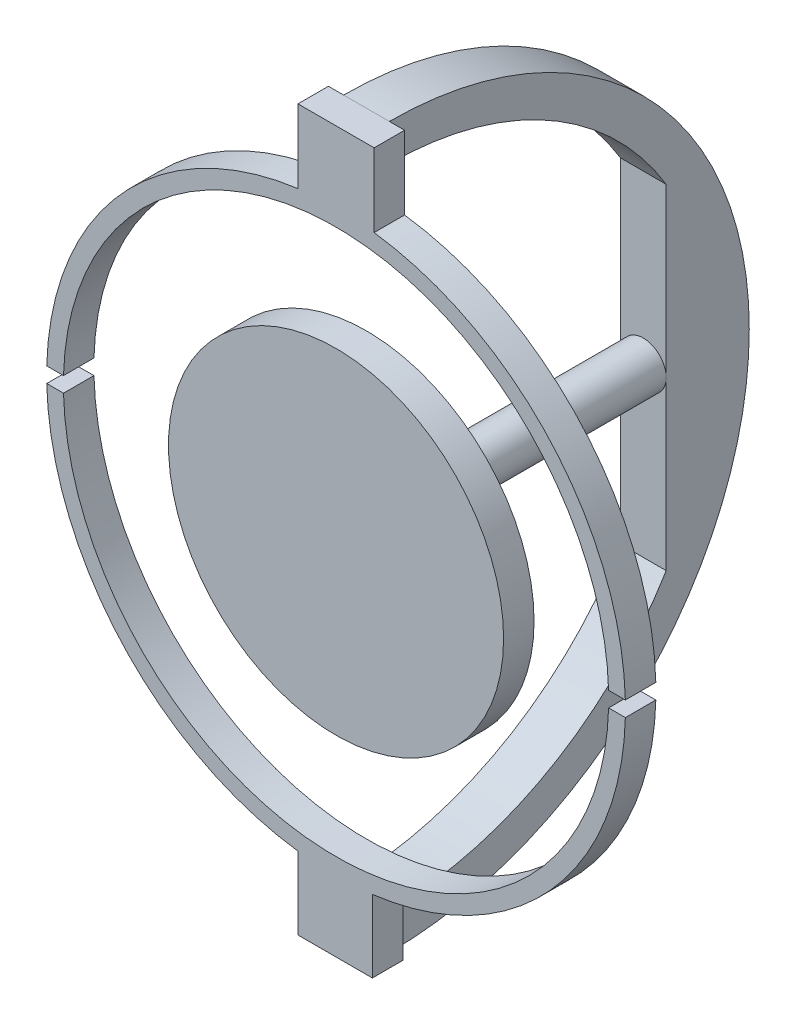
ISO-10303-21;
HEADER;
FILE_DESCRIPTION(('STEP AP214'),'2;1');
FILE_NAME('part.step','',(''),(''),'','','');
FILE_SCHEMA(('AUTOMOTIVE_DESIGN { 1 0 10303 214 1 1 1 1 }'));
ENDSEC;
DATA;
#1=APPLICATION_CONTEXT('core data for automotive mechanical design processes');
#2=APPLICATION_PROTOCOL_DEFINITION('international standard','automotive_design',2000,#1);
#3=PRODUCT_CONTEXT('',#1,'mechanical');
#4=PRODUCT('Part','Part','',(#3));
#5=PRODUCT_RELATED_PRODUCT_CATEGORY('part','',(#4));
#6=PRODUCT_DEFINITION_FORMATION('','',#4);
#7=PRODUCT_DEFINITION_CONTEXT('part definition',#1,'design');
#8=PRODUCT_DEFINITION('design','',#6,#7);
#9=PRODUCT_DEFINITION_SHAPE('','',#8);
#10=(LENGTH_UNIT() NAMED_UNIT(*) SI_UNIT(.MILLI.,.METRE.));
#11=(NAMED_UNIT(*) PLANE_ANGLE_UNIT() SI_UNIT($,.RADIAN.));
#12=(NAMED_UNIT(*) SI_UNIT($,.STERADIAN.) SOLID_ANGLE_UNIT());
#13=UNCERTAINTY_MEASURE_WITH_UNIT(LENGTH_MEASURE(1.E-05),#10,'distance_accuracy_value','');
#14=(GEOMETRIC_REPRESENTATION_CONTEXT(3) GLOBAL_UNCERTAINTY_ASSIGNED_CONTEXT((#13)) GLOBAL_UNIT_ASSIGNED_CONTEXT((#10,
#11,#12)) REPRESENTATION_CONTEXT('',''));
#15=CARTESIAN_POINT('',(0.,0.,0.));
#16=DIRECTION('',(0.,0.,1.));
#17=DIRECTION('',(1.,0.,0.));
#18=AXIS2_PLACEMENT_3D('',#15,#16,#17);
#19=CARTESIAN_POINT('',(0.,0.,-21.));
#20=DIRECTION('',(0.,0.,1.));
#21=DIRECTION('',(1.,0.,0.));
#22=AXIS2_PLACEMENT_3D('',#19,#20,#21);
#23=CYLINDRICAL_SURFACE('',#22,1.5);
#24=CARTESIAN_POINT('',(0.,0.,0.));
#25=DIRECTION('',(0.,0.,1.));
#26=DIRECTION('',(1.,0.,0.));
#27=AXIS2_PLACEMENT_3D('',#24,#25,#26);
#28=CIRCLE('',#27,1.5);
#29=CARTESIAN_POINT('',(1.5,0.,0.));
#30=VERTEX_POINT('',#29);
#31=EDGE_CURVE('E484',#30,#30,#28,.T.);
#32=ORIENTED_EDGE('',*,*,#31,.F.);
#33=EDGE_LOOP('',(#32));
#34=FACE_BOUND('',#33,.T.);
#35=CARTESIAN_POINT('',(0.,0.,-18.1748662479198));
#36=DIRECTION('',(0.,0.,-1.));
#37=DIRECTION('',(0.,1.,0.));
#38=AXIS2_PLACEMENT_3D('',#35,#36,#37);
#39=CIRCLE('',#38,1.5);
#40=CARTESIAN_POINT('',(1.5,0.,-18.1748662479198));
#41=VERTEX_POINT('',#40);
#42=CARTESIAN_POINT('',(-1.5,0.,-18.1748662479198));
#43=VERTEX_POINT('',#42);
#44=EDGE_CURVE('E103',#41,#43,#39,.F.);
#45=ORIENTED_EDGE('',*,*,#44,.T.);
#46=EDGE_CURVE('E12',#43,#41,#39,.F.);
#47=ORIENTED_EDGE('',*,*,#46,.T.);
#48=EDGE_LOOP('',(#45,#47));
#49=FACE_BOUND('',#48,.T.);
#50=ADVANCED_FACE('F99',(#34,#49),#23,.T.);
#51=CARTESIAN_POINT('',(0.,0.,2.));
#52=DIRECTION('',(0.,0.,-1.));
#53=DIRECTION('',(-1.,0.,0.));
#54=AXIS2_PLACEMENT_3D('',#51,#52,#53);
#55=CYLINDRICAL_SURFACE('',#54,11.);
#56=CARTESIAN_POINT('',(0.,0.,2.));
#57=DIRECTION('',(0.,0.,1.));
#58=DIRECTION('',(1.,0.,0.));
#59=AXIS2_PLACEMENT_3D('',#56,#57,#58);
#60=CIRCLE('',#59,11.);
#61=CARTESIAN_POINT('',(11.,0.,2.));
#62=VERTEX_POINT('',#61);
#63=EDGE_CURVE('E489',#62,#62,#60,.T.);
#64=ORIENTED_EDGE('',*,*,#63,.F.);
#65=EDGE_LOOP('',(#64));
#66=FACE_BOUND('',#65,.T.);
#67=CARTESIAN_POINT('',(0.,0.,0.));
#68=DIRECTION('',(0.,0.,1.));
#69=DIRECTION('',(1.,0.,0.));
#70=AXIS2_PLACEMENT_3D('',#67,#68,#69);
#71=CIRCLE('',#70,11.);
#72=CARTESIAN_POINT('',(11.,0.,0.));
#73=VERTEX_POINT('',#72);
#74=EDGE_CURVE('E488',#73,#73,#71,.T.);
#75=ORIENTED_EDGE('',*,*,#74,.T.);
#76=EDGE_LOOP('',(#75));
#77=FACE_BOUND('',#76,.T.);
#78=ADVANCED_FACE('F101',(#66,#77),#55,.T.);
#79=CARTESIAN_POINT('',(0.,0.,2.));
#80=DIRECTION('',(0.,0.,1.));
#81=DIRECTION('',(1.,0.,0.));
#82=AXIS2_PLACEMENT_3D('',#79,#80,#81);
#83=PLANE('',#82);
#84=ORIENTED_EDGE('',*,*,#63,.T.);
#85=EDGE_LOOP('',(#84));
#86=FACE_BOUND('',#85,.T.);
#87=ADVANCED_FACE('F500',(#86),#83,.T.);
#88=CARTESIAN_POINT('',(0.,0.,0.));
#89=DIRECTION('',(0.,0.,1.));
#90=DIRECTION('',(1.,0.,0.));
#91=AXIS2_PLACEMENT_3D('',#88,#89,#90);
#92=PLANE('',#91);
#93=ORIENTED_EDGE('',*,*,#31,.T.);
#94=EDGE_LOOP('',(#93));
#95=FACE_BOUND('',#94,.T.);
#96=ORIENTED_EDGE('',*,*,#74,.F.);
#97=EDGE_LOOP('',(#96));
#98=FACE_BOUND('',#97,.T.);
#99=ADVANCED_FACE('F497',(#95,#98),#92,.F.);
#100=CARTESIAN_POINT('',(1.5,0.,-18.1748662479198));
#101=DIRECTION('',(0.,0.,-1.));
#102=DIRECTION('',(0.,1.,0.));
#103=AXIS2_PLACEMENT_3D('',#100,#101,#102);
#104=PLANE('',#103);
#105=ORIENTED_EDGE('',*,*,#46,.F.);
#106=DIRECTION('',(0.,-1.,0.));
#107=VECTOR('',#106,1.);
#108=CARTESIAN_POINT('',(-1.5,0.,-18.1748662479198));
#109=LINE('',#108,#107);
#110=CARTESIAN_POINT('',(-1.5,-10.9739590917291,-18.1748662479198));
#111=VERTEX_POINT('',#110);
#112=EDGE_CURVE('E371',#43,#111,#109,.T.);
#113=ORIENTED_EDGE('',*,*,#112,.T.);
#114=DIRECTION('',(-1.,0.,0.));
#115=VECTOR('',#114,1.);
#116=CARTESIAN_POINT('',(1.5,-10.9739590917291,-18.1748662479198));
#117=LINE('',#116,#115);
#118=CARTESIAN_POINT('',(1.5,-10.9739590917291,-18.1748662479198));
#119=VERTEX_POINT('',#118);
#120=EDGE_CURVE('E399',#119,#111,#117,.T.);
#121=ORIENTED_EDGE('',*,*,#120,.F.);
#122=DIRECTION('',(0.,-1.,0.));
#123=VECTOR('',#122,1.);
#124=CARTESIAN_POINT('',(1.5,0.,-18.1748662479198));
#125=LINE('',#124,#123);
#126=EDGE_CURVE('E349',#41,#119,#125,.T.);
#127=ORIENTED_EDGE('',*,*,#126,.F.);
#128=EDGE_LOOP('',(#105,#113,#121,#127));
#129=FACE_BOUND('',#128,.T.);
#130=ADVANCED_FACE('F499',(#129),#104,.F.);
#131=CARTESIAN_POINT('',(0.,0.,2.));
#132=DIRECTION('',(0.,0.,-1.));
#133=DIRECTION('',(-1.,0.,0.));
#134=AXIS2_PLACEMENT_3D('',#131,#132,#133);
#135=CYLINDRICAL_SURFACE('',#134,19.);
#136=CARTESIAN_POINT('',(0.,0.,0.));
#137=DIRECTION('',(0.,0.,1.));
#138=DIRECTION('',(1.,0.,0.));
#139=AXIS2_PLACEMENT_3D('',#136,#137,#138);
#140=CIRCLE('',#139,19.);
#141=CARTESIAN_POINT('',(18.9932276414102,0.507251181932757,0.));
#142=VERTEX_POINT('',#141);
#143=CARTESIAN_POINT('',(2.5,18.8348082018374,0.));
#144=VERTEX_POINT('',#143);
#145=EDGE_CURVE('E406',#142,#144,#140,.T.);
#146=ORIENTED_EDGE('',*,*,#145,.T.);
#147=DIRECTION('',(0.,0.,-1.));
#148=VECTOR('',#147,1.);
#149=CARTESIAN_POINT('',(2.5,18.8348082018374,2.));
#150=LINE('',#149,#148);
#151=CARTESIAN_POINT('',(2.5,18.8348082018374,2.));
#152=VERTEX_POINT('',#151);
#153=EDGE_CURVE('E480',#152,#144,#150,.T.);
#154=ORIENTED_EDGE('',*,*,#153,.F.);
#155=CARTESIAN_POINT('',(0.,0.,2.));
#156=DIRECTION('',(0.,0.,1.));
#157=DIRECTION('',(1.,0.,0.));
#158=AXIS2_PLACEMENT_3D('',#155,#156,#157);
#159=CIRCLE('',#158,19.);
#160=CARTESIAN_POINT('',(18.9932276414102,0.507251181932757,2.));
#161=VERTEX_POINT('',#160);
#162=EDGE_CURVE('E407',#161,#152,#159,.T.);
#163=ORIENTED_EDGE('',*,*,#162,.F.);
#164=DIRECTION('',(0.,0.,-1.));
#165=VECTOR('',#164,1.);
#166=CARTESIAN_POINT('',(18.9932276414102,0.507251181932757,2.));
#167=LINE('',#166,#165);
#168=EDGE_CURVE('E456',#161,#142,#167,.T.);
#169=ORIENTED_EDGE('',*,*,#168,.T.);
#170=EDGE_LOOP('',(#146,#154,#163,#169));
#171=FACE_BOUND('',#170,.T.);
#172=ADVANCED_FACE('F506',(#171),#135,.T.);
#173=CARTESIAN_POINT('',(2.5,0.,2.));
#174=DIRECTION('',(-1.,0.,0.));
#175=DIRECTION('',(0.,0.,1.));
#176=AXIS2_PLACEMENT_3D('',#173,#174,#175);
#177=PLANE('',#176);
#178=DIRECTION('',(0.,1.,0.));
#179=VECTOR('',#178,1.);
#180=CARTESIAN_POINT('',(2.5,0.,0.));
#181=LINE('',#180,#179);
#182=CARTESIAN_POINT('',(2.5,23.6536962346135,0.));
#183=VERTEX_POINT('',#182);
#184=EDGE_CURVE('E435',#144,#183,#181,.T.);
#185=ORIENTED_EDGE('',*,*,#184,.T.);
#186=DIRECTION('',(0.,0.,-1.));
#187=VECTOR('',#186,1.);
#188=CARTESIAN_POINT('',(2.5,23.6536962346135,2.));
#189=LINE('',#188,#187);
#190=CARTESIAN_POINT('',(2.5,23.6536962346135,2.));
#191=VERTEX_POINT('',#190);
#192=EDGE_CURVE('E476',#191,#183,#189,.T.);
#193=ORIENTED_EDGE('',*,*,#192,.F.);
#194=DIRECTION('',(0.,1.,0.));
#195=VECTOR('',#194,1.);
#196=CARTESIAN_POINT('',(2.5,0.,2.));
#197=LINE('',#196,#195);
#198=EDGE_CURVE('E411',#152,#191,#197,.T.);
#199=ORIENTED_EDGE('',*,*,#198,.F.);
#200=ORIENTED_EDGE('',*,*,#153,.T.);
#201=EDGE_LOOP('',(#185,#193,#199,#200));
#202=FACE_BOUND('',#201,.T.);
#203=ADVANCED_FACE('F522',(#202),#177,.F.);
#204=CARTESIAN_POINT('',(0.,23.6536962346135,2.));
#205=DIRECTION('',(0.,1.,0.));
#206=DIRECTION('',(0.,0.,1.));
#207=AXIS2_PLACEMENT_3D('',#204,#205,#206);
#208=PLANE('',#207);
#209=DIRECTION('',(1.,0.,0.));
#210=VECTOR('',#209,1.);
#211=CARTESIAN_POINT('',(0.,23.6536962346135,0.));
#212=LINE('',#211,#210);
#213=CARTESIAN_POINT('',(-2.5,23.6536962346135,0.));
#214=VERTEX_POINT('',#213);
#215=CARTESIAN_POINT('',(-1.5,23.6536962346135,0.));
#216=VERTEX_POINT('',#215);
#217=EDGE_CURVE('E441',#214,#216,#212,.T.);
#218=ORIENTED_EDGE('',*,*,#217,.F.);
#219=DIRECTION('',(0.,0.,-1.));
#220=VECTOR('',#219,1.);
#221=CARTESIAN_POINT('',(-2.5,23.6536962346135,2.));
#222=LINE('',#221,#220);
#223=CARTESIAN_POINT('',(-2.5,23.6536962346135,2.));
#224=VERTEX_POINT('',#223);
#225=EDGE_CURVE('E473',#224,#214,#222,.T.);
#226=ORIENTED_EDGE('',*,*,#225,.F.);
#227=DIRECTION('',(1.,0.,0.));
#228=VECTOR('',#227,1.);
#229=CARTESIAN_POINT('',(0.,23.6536962346135,2.));
#230=LINE('',#229,#228);
#231=EDGE_CURVE('E416',#224,#191,#230,.T.);
#232=ORIENTED_EDGE('',*,*,#231,.T.);
#233=ORIENTED_EDGE('',*,*,#192,.T.);
#234=CARTESIAN_POINT('',(1.5,23.6536962346135,0.));
#235=VERTEX_POINT('',#234);
#236=EDGE_CURVE('E440',#235,#183,#212,.T.);
#237=ORIENTED_EDGE('',*,*,#236,.F.);
#238=DIRECTION('',(-1.,0.,0.));
#239=VECTOR('',#238,1.);
#240=CARTESIAN_POINT('',(1.5,23.6536962346135,0.));
#241=LINE('',#240,#239);
#242=EDGE_CURVE('E387',#235,#216,#241,.T.);
#243=ORIENTED_EDGE('',*,*,#242,.T.);
#244=EDGE_LOOP('',(#218,#226,#232,#233,#237,#243));
#245=FACE_BOUND('',#244,.T.);
#246=ADVANCED_FACE('F525',(#245),#208,.T.);
#247=CARTESIAN_POINT('',(-2.5,0.,2.));
#248=DIRECTION('',(-1.,0.,0.));
#249=DIRECTION('',(0.,0.,1.));
#250=AXIS2_PLACEMENT_3D('',#247,#248,#249);
#251=PLANE('',#250);
#252=DIRECTION('',(0.,1.,0.));
#253=VECTOR('',#252,1.);
#254=CARTESIAN_POINT('',(-2.5,0.,0.));
#255=LINE('',#254,#253);
#256=CARTESIAN_POINT('',(-2.5,18.8348082018374,0.));
#257=VERTEX_POINT('',#256);
#258=EDGE_CURVE('E444',#257,#214,#255,.T.);
#259=ORIENTED_EDGE('',*,*,#258,.F.);
#260=DIRECTION('',(0.,0.,-1.));
#261=VECTOR('',#260,1.);
#262=CARTESIAN_POINT('',(-2.5,18.8348082018374,2.));
#263=LINE('',#262,#261);
#264=CARTESIAN_POINT('',(-2.5,18.8348082018374,2.));
#265=VERTEX_POINT('',#264);
#266=EDGE_CURVE('E470',#265,#257,#263,.T.);
#267=ORIENTED_EDGE('',*,*,#266,.F.);
#268=DIRECTION('',(0.,1.,0.));
#269=VECTOR('',#268,1.);
#270=CARTESIAN_POINT('',(-2.5,0.,2.));
#271=LINE('',#270,#269);
#272=EDGE_CURVE('E420',#265,#224,#271,.T.);
#273=ORIENTED_EDGE('',*,*,#272,.T.);
#274=ORIENTED_EDGE('',*,*,#225,.T.);
#275=EDGE_LOOP('',(#259,#267,#273,#274));
#276=FACE_BOUND('',#275,.T.);
#277=ADVANCED_FACE('F529',(#276),#251,.T.);
#278=CARTESIAN_POINT('',(-18.9932276414102,0.507251181932757,0.));
#279=VERTEX_POINT('',#278);
#280=EDGE_CURVE('E436',#257,#279,#140,.T.);
#281=ORIENTED_EDGE('',*,*,#280,.T.);
#282=DIRECTION('',(0.,0.,-1.));
#283=VECTOR('',#282,1.);
#284=CARTESIAN_POINT('',(-18.9932276414102,0.507251181932757,2.));
#285=LINE('',#284,#283);
#286=CARTESIAN_POINT('',(-18.9932276414102,0.507251181932757,2.));
#287=VERTEX_POINT('',#286);
#288=EDGE_CURVE('E466',#287,#279,#285,.T.);
#289=ORIENTED_EDGE('',*,*,#288,.F.);
#290=EDGE_CURVE('E413',#265,#287,#159,.T.);
#291=ORIENTED_EDGE('',*,*,#290,.F.);
#292=ORIENTED_EDGE('',*,*,#266,.T.);
#293=EDGE_LOOP('',(#281,#289,#291,#292));
#294=FACE_BOUND('',#293,.T.);
#295=ADVANCED_FACE('F533',(#294),#135,.T.);
#296=CARTESIAN_POINT('',(0.,0.507251181932757,2.));
#297=DIRECTION('',(0.,1.,0.));
#298=DIRECTION('',(0.,0.,1.));
#299=AXIS2_PLACEMENT_3D('',#296,#297,#298);
#300=PLANE('',#299);
#301=DIRECTION('',(1.,0.,0.));
#302=VECTOR('',#301,1.);
#303=CARTESIAN_POINT('',(0.,0.507251181932757,0.));
#304=LINE('',#303,#302);
#305=CARTESIAN_POINT('',(-17.8928113005874,0.507251181932757,0.));
#306=VERTEX_POINT('',#305);
#307=EDGE_CURVE('E448',#279,#306,#304,.T.);
#308=ORIENTED_EDGE('',*,*,#307,.T.);
#309=DIRECTION('',(0.,0.,-1.));
#310=VECTOR('',#309,1.);
#311=CARTESIAN_POINT('',(-17.8928113005874,0.507251181932757,2.));
#312=LINE('',#311,#310);
#313=CARTESIAN_POINT('',(-17.8928113005874,0.507251181932757,2.));
#314=VERTEX_POINT('',#313);
#315=EDGE_CURVE('E463',#314,#306,#312,.T.);
#316=ORIENTED_EDGE('',*,*,#315,.F.);
#317=DIRECTION('',(1.,0.,0.));
#318=VECTOR('',#317,1.);
#319=CARTESIAN_POINT('',(0.,0.507251181932757,2.));
#320=LINE('',#319,#318);
#321=EDGE_CURVE('E424',#287,#314,#320,.T.);
#322=ORIENTED_EDGE('',*,*,#321,.F.);
#323=ORIENTED_EDGE('',*,*,#288,.T.);
#324=EDGE_LOOP('',(#308,#316,#322,#323));
#325=FACE_BOUND('',#324,.T.);
#326=ADVANCED_FACE('F537',(#325),#300,.F.);
#327=CARTESIAN_POINT('',(0.,0.,2.));
#328=DIRECTION('',(0.,0.,-1.));
#329=DIRECTION('',(-1.,0.,0.));
#330=AXIS2_PLACEMENT_3D('',#327,#328,#329);
#331=CYLINDRICAL_SURFACE('',#330,17.9);
#332=CARTESIAN_POINT('',(0.,0.,0.));
#333=DIRECTION('',(0.,0.,1.));
#334=DIRECTION('',(1.,0.,0.));
#335=AXIS2_PLACEMENT_3D('',#332,#333,#334);
#336=CIRCLE('',#335,17.9);
#337=CARTESIAN_POINT('',(17.8928113005874,0.507251181932757,0.));
#338=VERTEX_POINT('',#337);
#339=EDGE_CURVE('E452',#338,#306,#336,.T.);
#340=ORIENTED_EDGE('',*,*,#339,.F.);
#341=DIRECTION('',(0.,0.,-1.));
#342=VECTOR('',#341,1.);
#343=CARTESIAN_POINT('',(17.8928113005874,0.507251181932757,2.));
#344=LINE('',#343,#342);
#345=CARTESIAN_POINT('',(17.8928113005874,0.507251181932757,2.));
#346=VERTEX_POINT('',#345);
#347=EDGE_CURVE('E460',#346,#338,#344,.T.);
#348=ORIENTED_EDGE('',*,*,#347,.F.);
#349=CARTESIAN_POINT('',(0.,0.,2.));
#350=DIRECTION('',(0.,0.,1.));
#351=DIRECTION('',(1.,0.,0.));
#352=AXIS2_PLACEMENT_3D('',#349,#350,#351);
#353=CIRCLE('',#352,17.9);
#354=EDGE_CURVE('E427',#346,#314,#353,.T.);
#355=ORIENTED_EDGE('',*,*,#354,.T.);
#356=ORIENTED_EDGE('',*,*,#315,.T.);
#357=EDGE_LOOP('',(#340,#348,#355,#356));
#358=FACE_BOUND('',#357,.T.);
#359=ADVANCED_FACE('F539',(#358),#331,.F.);
#360=EDGE_CURVE('E412',#338,#142,#304,.T.);
#361=ORIENTED_EDGE('',*,*,#360,.T.);
#362=ORIENTED_EDGE('',*,*,#168,.F.);
#363=EDGE_CURVE('E428',#346,#161,#320,.T.);
#364=ORIENTED_EDGE('',*,*,#363,.F.);
#365=ORIENTED_EDGE('',*,*,#347,.T.);
#366=EDGE_LOOP('',(#361,#362,#364,#365));
#367=FACE_BOUND('',#366,.T.);
#368=ADVANCED_FACE('F542',(#367),#300,.F.);
#369=CARTESIAN_POINT('',(0.,0.,2.));
#370=DIRECTION('',(0.,0.,1.));
#371=DIRECTION('',(1.,0.,0.));
#372=AXIS2_PLACEMENT_3D('',#369,#370,#371);
#373=PLANE('',#372);
#374=ORIENTED_EDGE('',*,*,#162,.T.);
#375=ORIENTED_EDGE('',*,*,#198,.T.);
#376=ORIENTED_EDGE('',*,*,#231,.F.);
#377=ORIENTED_EDGE('',*,*,#272,.F.);
#378=ORIENTED_EDGE('',*,*,#290,.T.);
#379=ORIENTED_EDGE('',*,*,#321,.T.);
#380=ORIENTED_EDGE('',*,*,#354,.F.);
#381=ORIENTED_EDGE('',*,*,#363,.T.);
#382=EDGE_LOOP('',(#374,#375,#376,#377,#378,#379,#380,#381));
#383=FACE_BOUND('',#382,.T.);
#384=ADVANCED_FACE('F546',(#383),#373,.T.);
#385=CARTESIAN_POINT('',(0.,0.,0.));
#386=DIRECTION('',(0.,0.,1.));
#387=DIRECTION('',(1.,0.,0.));
#388=AXIS2_PLACEMENT_3D('',#385,#386,#387);
#389=PLANE('',#388);
#390=DIRECTION('',(-1.,0.,0.));
#391=VECTOR('',#390,1.);
#392=CARTESIAN_POINT('',(1.5,21.2442522182254,0.));
#393=LINE('',#392,#391);
#394=CARTESIAN_POINT('',(1.5,21.2442522182254,0.));
#395=VERTEX_POINT('',#394);
#396=CARTESIAN_POINT('',(-1.5,21.2442522182254,0.));
#397=VERTEX_POINT('',#396);
#398=EDGE_CURVE('E367',#395,#397,#393,.T.);
#399=ORIENTED_EDGE('',*,*,#398,.F.);
#400=DIRECTION('',(0.,-1.,0.));
#401=VECTOR('',#400,1.);
#402=CARTESIAN_POINT('',(1.5,0.,0.));
#403=LINE('',#402,#401);
#404=EDGE_CURVE('E363',#235,#395,#403,.T.);
#405=ORIENTED_EDGE('',*,*,#404,.F.);
#406=ORIENTED_EDGE('',*,*,#236,.T.);
#407=ORIENTED_EDGE('',*,*,#184,.F.);
#408=ORIENTED_EDGE('',*,*,#145,.F.);
#409=ORIENTED_EDGE('',*,*,#360,.F.);
#410=ORIENTED_EDGE('',*,*,#339,.T.);
#411=ORIENTED_EDGE('',*,*,#307,.F.);
#412=ORIENTED_EDGE('',*,*,#280,.F.);
#413=ORIENTED_EDGE('',*,*,#258,.T.);
#414=ORIENTED_EDGE('',*,*,#217,.T.);
#415=DIRECTION('',(0.,-1.,0.));
#416=VECTOR('',#415,1.);
#417=CARTESIAN_POINT('',(-1.5,0.,0.));
#418=LINE('',#417,#416);
#419=EDGE_CURVE('E350',#216,#397,#418,.T.);
#420=ORIENTED_EDGE('',*,*,#419,.T.);
#421=EDGE_LOOP('',(#399,#405,#406,#407,#408,#409,#410,#411,#412,#413,#414,#420));
#422=FACE_BOUND('',#421,.T.);
#423=ADVANCED_FACE('F548',(#422),#389,.F.);
#424=CARTESIAN_POINT('',(1.5,0.00876384833136019,0.));
#425=DIRECTION('',(-1.,0.,0.));
#426=DIRECTION('',(0.,0.,1.));
#427=AXIS2_PLACEMENT_3D('',#424,#425,#426);
#428=CYLINDRICAL_SURFACE('',#427,21.2354883698941);
#429=CARTESIAN_POINT('',(-1.5,0.00876384833136019,0.));
#430=DIRECTION('',(1.,0.,0.));
#431=DIRECTION('',(0.,0.,-1.));
#432=AXIS2_PLACEMENT_3D('',#429,#430,#431);
#433=CIRCLE('',#432,21.2354883698941);
#434=CARTESIAN_POINT('',(-1.5,10.9914867883918,-18.1748662479198));
#435=VERTEX_POINT('',#434);
#436=EDGE_CURVE('E265',#397,#435,#433,.F.);
#437=ORIENTED_EDGE('',*,*,#436,.T.);
#438=DIRECTION('',(-1.,0.,0.));
#439=VECTOR('',#438,1.);
#440=CARTESIAN_POINT('',(1.5,10.9914867883918,-18.1748662479198));
#441=LINE('',#440,#439);
#442=CARTESIAN_POINT('',(1.5,10.9914867883918,-18.1748662479198));
#443=VERTEX_POINT('',#442);
#444=EDGE_CURVE('E403',#443,#435,#441,.T.);
#445=ORIENTED_EDGE('',*,*,#444,.F.);
#446=CARTESIAN_POINT('',(1.5,0.00876384833136019,0.));
#447=DIRECTION('',(1.,0.,0.));
#448=DIRECTION('',(0.,0.,-1.));
#449=AXIS2_PLACEMENT_3D('',#446,#447,#448);
#450=CIRCLE('',#449,21.2354883698941);
#451=EDGE_CURVE('E345',#395,#443,#450,.F.);
#452=ORIENTED_EDGE('',*,*,#451,.F.);
#453=ORIENTED_EDGE('',*,*,#398,.T.);
#454=EDGE_LOOP('',(#437,#445,#452,#453));
#455=FACE_BOUND('',#454,.T.);
#456=ADVANCED_FACE('F551',(#455),#428,.F.);
#457=ORIENTED_EDGE('',*,*,#44,.F.);
#458=EDGE_CURVE('E352',#443,#41,#125,.T.);
#459=ORIENTED_EDGE('',*,*,#458,.F.);
#460=ORIENTED_EDGE('',*,*,#444,.T.);
#461=EDGE_CURVE('E115',#435,#43,#109,.T.);
#462=ORIENTED_EDGE('',*,*,#461,.T.);
#463=EDGE_LOOP('',(#457,#459,#460,#462));
#464=FACE_BOUND('',#463,.T.);
#465=ADVANCED_FACE('F509',(#464),#104,.F.);
#466=CARTESIAN_POINT('',(-1.5,-21.2267245215627,0.));
#467=VERTEX_POINT('',#466);
#468=EDGE_CURVE('E372',#111,#467,#433,.F.);
#469=ORIENTED_EDGE('',*,*,#468,.T.);
#470=DIRECTION('',(-1.,0.,0.));
#471=VECTOR('',#470,1.);
#472=CARTESIAN_POINT('',(1.5,-21.2267245215627,0.));
#473=LINE('',#472,#471);
#474=CARTESIAN_POINT('',(1.5,-21.2267245215627,0.));
#475=VERTEX_POINT('',#474);
#476=EDGE_CURVE('E395',#475,#467,#473,.T.);
#477=ORIENTED_EDGE('',*,*,#476,.F.);
#478=EDGE_CURVE('E351',#119,#475,#450,.F.);
#479=ORIENTED_EDGE('',*,*,#478,.F.);
#480=ORIENTED_EDGE('',*,*,#120,.T.);
#481=EDGE_LOOP('',(#469,#477,#479,#480));
#482=FACE_BOUND('',#481,.T.);
#483=ADVANCED_FACE('F557',(#482),#428,.F.);
#484=CARTESIAN_POINT('',(1.5,0.0250376224850656,0.));
#485=DIRECTION('',(-1.,0.,0.));
#486=DIRECTION('',(0.,0.,1.));
#487=AXIS2_PLACEMENT_3D('',#484,#485,#486);
#488=CYLINDRICAL_SURFACE('',#487,23.6286586121284);
#489=CARTESIAN_POINT('',(-1.5,0.0250376224850656,0.));
#490=DIRECTION('',(1.,0.,0.));
#491=DIRECTION('',(0.,0.,-1.));
#492=AXIS2_PLACEMENT_3D('',#489,#490,#491);
#493=CIRCLE('',#492,23.6286586121284);
#494=CARTESIAN_POINT('',(-1.5,-23.6036209896433,0.));
#495=VERTEX_POINT('',#494);
#496=EDGE_CURVE('E379',#216,#495,#493,.F.);
#497=ORIENTED_EDGE('',*,*,#496,.F.);
#498=ORIENTED_EDGE('',*,*,#242,.F.);
#499=CARTESIAN_POINT('',(1.5,0.0250376224850656,0.));
#500=DIRECTION('',(1.,0.,0.));
#501=DIRECTION('',(0.,0.,-1.));
#502=AXIS2_PLACEMENT_3D('',#499,#500,#501);
#503=CIRCLE('',#502,23.6286586121284);
#504=CARTESIAN_POINT('',(1.5,-23.6036209896433,0.));
#505=VERTEX_POINT('',#504);
#506=EDGE_CURVE('E359',#235,#505,#503,.F.);
#507=ORIENTED_EDGE('',*,*,#506,.T.);
#508=DIRECTION('',(-1.,0.,0.));
#509=VECTOR('',#508,1.);
#510=CARTESIAN_POINT('',(1.5,-23.6036209896433,0.));
#511=LINE('',#510,#509);
#512=EDGE_CURVE('E391',#505,#495,#511,.T.);
#513=ORIENTED_EDGE('',*,*,#512,.T.);
#514=EDGE_LOOP('',(#497,#498,#507,#513));
#515=FACE_BOUND('',#514,.T.);
#516=ADVANCED_FACE('F560',(#515),#488,.T.);
#517=CARTESIAN_POINT('',(1.5,0.,0.));
#518=DIRECTION('',(1.,0.,0.));
#519=DIRECTION('',(0.,0.,-1.));
#520=AXIS2_PLACEMENT_3D('',#517,#518,#519);
#521=PLANE('',#520);
#522=ORIENTED_EDGE('',*,*,#451,.T.);
#523=ORIENTED_EDGE('',*,*,#458,.T.);
#524=ORIENTED_EDGE('',*,*,#126,.T.);
#525=ORIENTED_EDGE('',*,*,#478,.T.);
#526=DIRECTION('',(0.,-1.,0.));
#527=VECTOR('',#526,1.);
#528=CARTESIAN_POINT('',(1.5,0.,0.));
#529=LINE('',#528,#527);
#530=EDGE_CURVE('E356',#475,#505,#529,.T.);
#531=ORIENTED_EDGE('',*,*,#530,.T.);
#532=ORIENTED_EDGE('',*,*,#506,.F.);
#533=ORIENTED_EDGE('',*,*,#404,.T.);
#534=EDGE_LOOP('',(#522,#523,#524,#525,#531,#532,#533));
#535=FACE_BOUND('',#534,.T.);
#536=ADVANCED_FACE('F564',(#535),#521,.T.);
#537=CARTESIAN_POINT('',(-1.5,0.,0.));
#538=DIRECTION('',(1.,0.,0.));
#539=DIRECTION('',(0.,0.,-1.));
#540=AXIS2_PLACEMENT_3D('',#537,#538,#539);
#541=PLANE('',#540);
#542=ORIENTED_EDGE('',*,*,#436,.F.);
#543=ORIENTED_EDGE('',*,*,#419,.F.);
#544=ORIENTED_EDGE('',*,*,#496,.T.);
#545=DIRECTION('',(0.,-1.,0.));
#546=VECTOR('',#545,1.);
#547=CARTESIAN_POINT('',(-1.5,0.,0.));
#548=LINE('',#547,#546);
#549=EDGE_CURVE('E375',#467,#495,#548,.T.);
#550=ORIENTED_EDGE('',*,*,#549,.F.);
#551=ORIENTED_EDGE('',*,*,#468,.F.);
#552=ORIENTED_EDGE('',*,*,#112,.F.);
#553=ORIENTED_EDGE('',*,*,#461,.F.);
#554=EDGE_LOOP('',(#542,#543,#544,#550,#551,#552,#553));
#555=FACE_BOUND('',#554,.T.);
#556=ADVANCED_FACE('F566',(#555),#541,.F.);
#557=CARTESIAN_POINT('',(0.,0.,2.));
#558=DIRECTION('',(0.,0.,-1.));
#559=DIRECTION('',(-1.,0.,0.));
#560=AXIS2_PLACEMENT_3D('',#557,#558,#559);
#561=CYLINDRICAL_SURFACE('',#560,17.9);
#562=CARTESIAN_POINT('',(0.,0.,0.));
#563=DIRECTION('',(0.,0.,1.));
#564=DIRECTION('',(1.,0.,0.));
#565=AXIS2_PLACEMENT_3D('',#562,#563,#564);
#566=CIRCLE('',#565,17.9);
#567=CARTESIAN_POINT('',(-17.8932165527133,-0.492748818067243,0.));
#568=VERTEX_POINT('',#567);
#569=CARTESIAN_POINT('',(17.8932165527133,-0.492748818067243,0.));
#570=VERTEX_POINT('',#569);
#571=EDGE_CURVE('E259',#568,#570,#566,.T.);
#572=ORIENTED_EDGE('',*,*,#571,.F.);
#573=DIRECTION('',(0.,0.,-1.));
#574=VECTOR('',#573,1.);
#575=CARTESIAN_POINT('',(-17.8932165527133,-0.492748818067243,2.));
#576=LINE('',#575,#574);
#577=CARTESIAN_POINT('',(-17.8932165527133,-0.492748818067243,2.));
#578=VERTEX_POINT('',#577);
#579=EDGE_CURVE('E253',#578,#568,#576,.T.);
#580=ORIENTED_EDGE('',*,*,#579,.F.);
#581=CARTESIAN_POINT('',(0.,0.,2.));
#582=DIRECTION('',(0.,0.,1.));
#583=DIRECTION('',(1.,0.,0.));
#584=AXIS2_PLACEMENT_3D('',#581,#582,#583);
#585=CIRCLE('',#584,17.9);
#586=CARTESIAN_POINT('',(17.8932165527133,-0.492748818067243,2.));
#587=VERTEX_POINT('',#586);
#588=EDGE_CURVE('E256',#578,#587,#585,.T.);
#589=ORIENTED_EDGE('',*,*,#588,.T.);
#590=DIRECTION('',(0.,0.,-1.));
#591=VECTOR('',#590,1.);
#592=CARTESIAN_POINT('',(17.8932165527133,-0.492748818067243,2.));
#593=LINE('',#592,#591);
#594=EDGE_CURVE('E287',#587,#570,#593,.T.);
#595=ORIENTED_EDGE('',*,*,#594,.T.);
#596=EDGE_LOOP('',(#572,#580,#589,#595));
#597=FACE_BOUND('',#596,.T.);
#598=ADVANCED_FACE('F255',(#597),#561,.F.);
#599=CARTESIAN_POINT('',(0.,-0.492748818067243,2.));
#600=DIRECTION('',(0.,1.,0.));
#601=DIRECTION('',(0.,0.,1.));
#602=AXIS2_PLACEMENT_3D('',#599,#600,#601);
#603=PLANE('',#602);
#604=DIRECTION('',(1.,0.,0.));
#605=VECTOR('',#604,1.);
#606=CARTESIAN_POINT('',(0.,-0.492748818067243,0.));
#607=LINE('',#606,#605);
#608=CARTESIAN_POINT('',(-18.9936094148083,-0.492748818067243,0.));
#609=VERTEX_POINT('',#608);
#610=EDGE_CURVE('E307',#609,#568,#607,.T.);
#611=ORIENTED_EDGE('',*,*,#610,.F.);
#612=DIRECTION('',(0.,0.,-1.));
#613=VECTOR('',#612,1.);
#614=CARTESIAN_POINT('',(-18.9936094148083,-0.492748818067243,2.));
#615=LINE('',#614,#613);
#616=CARTESIAN_POINT('',(-18.9936094148083,-0.492748818067243,2.));
#617=VERTEX_POINT('',#616);
#618=EDGE_CURVE('E266',#617,#609,#615,.T.);
#619=ORIENTED_EDGE('',*,*,#618,.F.);
#620=DIRECTION('',(1.,0.,0.));
#621=VECTOR('',#620,1.);
#622=CARTESIAN_POINT('',(0.,-0.492748818067243,2.));
#623=LINE('',#622,#621);
#624=EDGE_CURVE('E271',#617,#578,#623,.T.);
#625=ORIENTED_EDGE('',*,*,#624,.T.);
#626=ORIENTED_EDGE('',*,*,#579,.T.);
#627=EDGE_LOOP('',(#611,#619,#625,#626));
#628=FACE_BOUND('',#627,.T.);
#629=ADVANCED_FACE('F277',(#628),#603,.T.);
#630=CARTESIAN_POINT('',(0.,0.,2.));
#631=DIRECTION('',(0.,0.,-1.));
#632=DIRECTION('',(-1.,0.,0.));
#633=AXIS2_PLACEMENT_3D('',#630,#631,#632);
#634=CYLINDRICAL_SURFACE('',#633,19.);
#635=CARTESIAN_POINT('',(0.,0.,0.));
#636=DIRECTION('',(0.,0.,1.));
#637=DIRECTION('',(1.,0.,0.));
#638=AXIS2_PLACEMENT_3D('',#635,#636,#637);
#639=CIRCLE('',#638,19.);
#640=CARTESIAN_POINT('',(-2.5,-18.8348082018374,0.));
#641=VERTEX_POINT('',#640);
#642=EDGE_CURVE('E310',#609,#641,#639,.T.);
#643=ORIENTED_EDGE('',*,*,#642,.T.);
#644=DIRECTION('',(0.,0.,-1.));
#645=VECTOR('',#644,1.);
#646=CARTESIAN_POINT('',(-2.5,-18.8348082018374,2.));
#647=LINE('',#646,#645);
#648=CARTESIAN_POINT('',(-2.5,-18.8348082018374,2.));
#649=VERTEX_POINT('',#648);
#650=EDGE_CURVE('E340',#649,#641,#647,.T.);
#651=ORIENTED_EDGE('',*,*,#650,.F.);
#652=CARTESIAN_POINT('',(0.,0.,2.));
#653=DIRECTION('',(0.,0.,1.));
#654=DIRECTION('',(1.,0.,0.));
#655=AXIS2_PLACEMENT_3D('',#652,#653,#654);
#656=CIRCLE('',#655,19.);
#657=EDGE_CURVE('E280',#617,#649,#656,.T.);
#658=ORIENTED_EDGE('',*,*,#657,.F.);
#659=ORIENTED_EDGE('',*,*,#618,.T.);
#660=EDGE_LOOP('',(#643,#651,#658,#659));
#661=FACE_BOUND('',#660,.T.);
#662=ADVANCED_FACE('F579',(#661),#634,.T.);
#663=CARTESIAN_POINT('',(-2.5,0.,2.));
#664=DIRECTION('',(-1.,0.,0.));
#665=DIRECTION('',(0.,0.,1.));
#666=AXIS2_PLACEMENT_3D('',#663,#664,#665);
#667=PLANE('',#666);
#668=DIRECTION('',(0.,1.,0.));
#669=VECTOR('',#668,1.);
#670=CARTESIAN_POINT('',(-2.5,0.,0.));
#671=LINE('',#670,#669);
#672=CARTESIAN_POINT('',(-2.5,-23.6036209896433,0.));
#673=VERTEX_POINT('',#672);
#674=EDGE_CURVE('E314',#673,#641,#671,.T.);
#675=ORIENTED_EDGE('',*,*,#674,.F.);
#676=DIRECTION('',(0.,0.,-1.));
#677=VECTOR('',#676,1.);
#678=CARTESIAN_POINT('',(-2.5,-23.6036209896433,2.));
#679=LINE('',#678,#677);
#680=CARTESIAN_POINT('',(-2.5,-23.6036209896433,2.));
#681=VERTEX_POINT('',#680);
#682=EDGE_CURVE('E337',#681,#673,#679,.T.);
#683=ORIENTED_EDGE('',*,*,#682,.F.);
#684=DIRECTION('',(0.,1.,0.));
#685=VECTOR('',#684,1.);
#686=CARTESIAN_POINT('',(-2.5,0.,2.));
#687=LINE('',#686,#685);
#688=EDGE_CURVE('E283',#681,#649,#687,.T.);
#689=ORIENTED_EDGE('',*,*,#688,.T.);
#690=ORIENTED_EDGE('',*,*,#650,.T.);
#691=EDGE_LOOP('',(#675,#683,#689,#690));
#692=FACE_BOUND('',#691,.T.);
#693=ADVANCED_FACE('F575',(#692),#667,.T.);
#694=CARTESIAN_POINT('',(0.,-23.6036209896433,2.));
#695=DIRECTION('',(0.,1.,0.));
#696=DIRECTION('',(0.,0.,1.));
#697=AXIS2_PLACEMENT_3D('',#694,#695,#696);
#698=PLANE('',#697);
#699=DIRECTION('',(1.,0.,0.));
#700=VECTOR('',#699,1.);
#701=CARTESIAN_POINT('',(0.,-23.6036209896433,0.));
#702=LINE('',#701,#700);
#703=EDGE_CURVE('E320',#673,#495,#702,.T.);
#704=ORIENTED_EDGE('',*,*,#703,.T.);
#705=ORIENTED_EDGE('',*,*,#512,.F.);
#706=CARTESIAN_POINT('',(2.3841103905149,-23.6036209896433,0.));
#707=VERTEX_POINT('',#706);
#708=EDGE_CURVE('E319',#505,#707,#702,.T.);
#709=ORIENTED_EDGE('',*,*,#708,.T.);
#710=DIRECTION('',(0.,0.,-1.));
#711=VECTOR('',#710,1.);
#712=CARTESIAN_POINT('',(2.3841103905149,-23.6036209896433,2.));
#713=LINE('',#712,#711);
#714=CARTESIAN_POINT('',(2.3841103905149,-23.6036209896433,2.));
#715=VERTEX_POINT('',#714);
#716=EDGE_CURVE('E333',#715,#707,#713,.T.);
#717=ORIENTED_EDGE('',*,*,#716,.F.);
#718=DIRECTION('',(1.,0.,0.));
#719=VECTOR('',#718,1.);
#720=CARTESIAN_POINT('',(0.,-23.6036209896433,2.));
#721=LINE('',#720,#719);
#722=EDGE_CURVE('E297',#681,#715,#721,.T.);
#723=ORIENTED_EDGE('',*,*,#722,.F.);
#724=ORIENTED_EDGE('',*,*,#682,.T.);
#725=EDGE_LOOP('',(#704,#705,#709,#717,#723,#724));
#726=FACE_BOUND('',#725,.T.);
#727=ADVANCED_FACE('F578',(#726),#698,.F.);
#728=CARTESIAN_POINT('',(2.3841103905149,0.,2.));
#729=DIRECTION('',(-1.,0.,0.));
#730=DIRECTION('',(0.,0.,1.));
#731=AXIS2_PLACEMENT_3D('',#728,#729,#730);
#732=PLANE('',#731);
#733=DIRECTION('',(0.,1.,0.));
#734=VECTOR('',#733,1.);
#735=CARTESIAN_POINT('',(2.3841103905149,0.,0.));
#736=LINE('',#735,#734);
#737=CARTESIAN_POINT('',(2.3841103905149,-18.849828053482,0.));
#738=VERTEX_POINT('',#737);
#739=EDGE_CURVE('E324',#707,#738,#736,.T.);
#740=ORIENTED_EDGE('',*,*,#739,.T.);
#741=DIRECTION('',(0.,0.,-1.));
#742=VECTOR('',#741,1.);
#743=CARTESIAN_POINT('',(2.3841103905149,-18.849828053482,2.));
#744=LINE('',#743,#742);
#745=CARTESIAN_POINT('',(2.3841103905149,-18.849828053482,2.));
#746=VERTEX_POINT('',#745);
#747=EDGE_CURVE('E329',#746,#738,#744,.T.);
#748=ORIENTED_EDGE('',*,*,#747,.F.);
#749=DIRECTION('',(0.,1.,0.));
#750=VECTOR('',#749,1.);
#751=CARTESIAN_POINT('',(2.3841103905149,0.,2.));
#752=LINE('',#751,#750);
#753=EDGE_CURVE('E293',#715,#746,#752,.T.);
#754=ORIENTED_EDGE('',*,*,#753,.F.);
#755=ORIENTED_EDGE('',*,*,#716,.T.);
#756=EDGE_LOOP('',(#740,#748,#754,#755));
#757=FACE_BOUND('',#756,.T.);
#758=ADVANCED_FACE('F583',(#757),#732,.F.);
#759=CARTESIAN_POINT('',(18.9936094148083,-0.492748818067243,0.));
#760=VERTEX_POINT('',#759);
#761=EDGE_CURVE('E315',#738,#760,#639,.T.);
#762=ORIENTED_EDGE('',*,*,#761,.T.);
#763=DIRECTION('',(0.,0.,-1.));
#764=VECTOR('',#763,1.);
#765=CARTESIAN_POINT('',(18.9936094148083,-0.492748818067243,2.));
#766=LINE('',#765,#764);
#767=CARTESIAN_POINT('',(18.9936094148083,-0.492748818067243,2.));
#768=VERTEX_POINT('',#767);
#769=EDGE_CURVE('E291',#768,#760,#766,.T.);
#770=ORIENTED_EDGE('',*,*,#769,.F.);
#771=EDGE_CURVE('E285',#746,#768,#656,.T.);
#772=ORIENTED_EDGE('',*,*,#771,.F.);
#773=ORIENTED_EDGE('',*,*,#747,.T.);
#774=EDGE_LOOP('',(#762,#770,#772,#773));
#775=FACE_BOUND('',#774,.T.);
#776=ADVANCED_FACE('F587',(#775),#634,.T.);
#777=EDGE_CURVE('E275',#570,#760,#607,.T.);
#778=ORIENTED_EDGE('',*,*,#777,.F.);
#779=ORIENTED_EDGE('',*,*,#594,.F.);
#780=EDGE_CURVE('E273',#587,#768,#623,.T.);
#781=ORIENTED_EDGE('',*,*,#780,.T.);
#782=ORIENTED_EDGE('',*,*,#769,.T.);
#783=EDGE_LOOP('',(#778,#779,#781,#782));
#784=FACE_BOUND('',#783,.T.);
#785=ADVANCED_FACE('F591',(#784),#603,.T.);
#786=CARTESIAN_POINT('',(0.,0.,2.));
#787=DIRECTION('',(0.,0.,1.));
#788=DIRECTION('',(1.,0.,0.));
#789=AXIS2_PLACEMENT_3D('',#786,#787,#788);
#790=PLANE('',#789);
#791=ORIENTED_EDGE('',*,*,#588,.F.);
#792=ORIENTED_EDGE('',*,*,#624,.F.);
#793=ORIENTED_EDGE('',*,*,#657,.T.);
#794=ORIENTED_EDGE('',*,*,#688,.F.);
#795=ORIENTED_EDGE('',*,*,#722,.T.);
#796=ORIENTED_EDGE('',*,*,#753,.T.);
#797=ORIENTED_EDGE('',*,*,#771,.T.);
#798=ORIENTED_EDGE('',*,*,#780,.F.);
#799=EDGE_LOOP('',(#791,#792,#793,#794,#795,#796,#797,#798));
#800=FACE_BOUND('',#799,.T.);
#801=ADVANCED_FACE('F270',(#800),#790,.T.);
#802=CARTESIAN_POINT('',(0.,0.,0.));
#803=DIRECTION('',(0.,0.,1.));
#804=DIRECTION('',(1.,0.,0.));
#805=AXIS2_PLACEMENT_3D('',#802,#803,#804);
#806=PLANE('',#805);
#807=ORIENTED_EDGE('',*,*,#530,.F.);
#808=ORIENTED_EDGE('',*,*,#476,.T.);
#809=ORIENTED_EDGE('',*,*,#549,.T.);
#810=ORIENTED_EDGE('',*,*,#703,.F.);
#811=ORIENTED_EDGE('',*,*,#674,.T.);
#812=ORIENTED_EDGE('',*,*,#642,.F.);
#813=ORIENTED_EDGE('',*,*,#610,.T.);
#814=ORIENTED_EDGE('',*,*,#571,.T.);
#815=ORIENTED_EDGE('',*,*,#777,.T.);
#816=ORIENTED_EDGE('',*,*,#761,.F.);
#817=ORIENTED_EDGE('',*,*,#739,.F.);
#818=ORIENTED_EDGE('',*,*,#708,.F.);
#819=EDGE_LOOP('',(#807,#808,#809,#810,#811,#812,#813,#814,#815,#816,#817,#818));
#820=FACE_BOUND('',#819,.T.);
#821=ADVANCED_FACE('F595',(#820),#806,.F.);
#822=CLOSED_SHELL('',(#50,#78,#87,#99,#130,#172,#203,#246,#277,#295,#326,#359,#368,#384,#423,
#456,#465,#483,#516,#536,#556,#598,#629,#662,#693,#727,#758,#776,#785,#801,#821));
#823=MANIFOLD_SOLID_BREP('B2',#822);
#824=ADVANCED_BREP_SHAPE_REPRESENTATION('',(#18,#823),#14);
#825=SHAPE_DEFINITION_REPRESENTATION(#9,#824);
ENDSEC;
END-ISO-10303-21;
